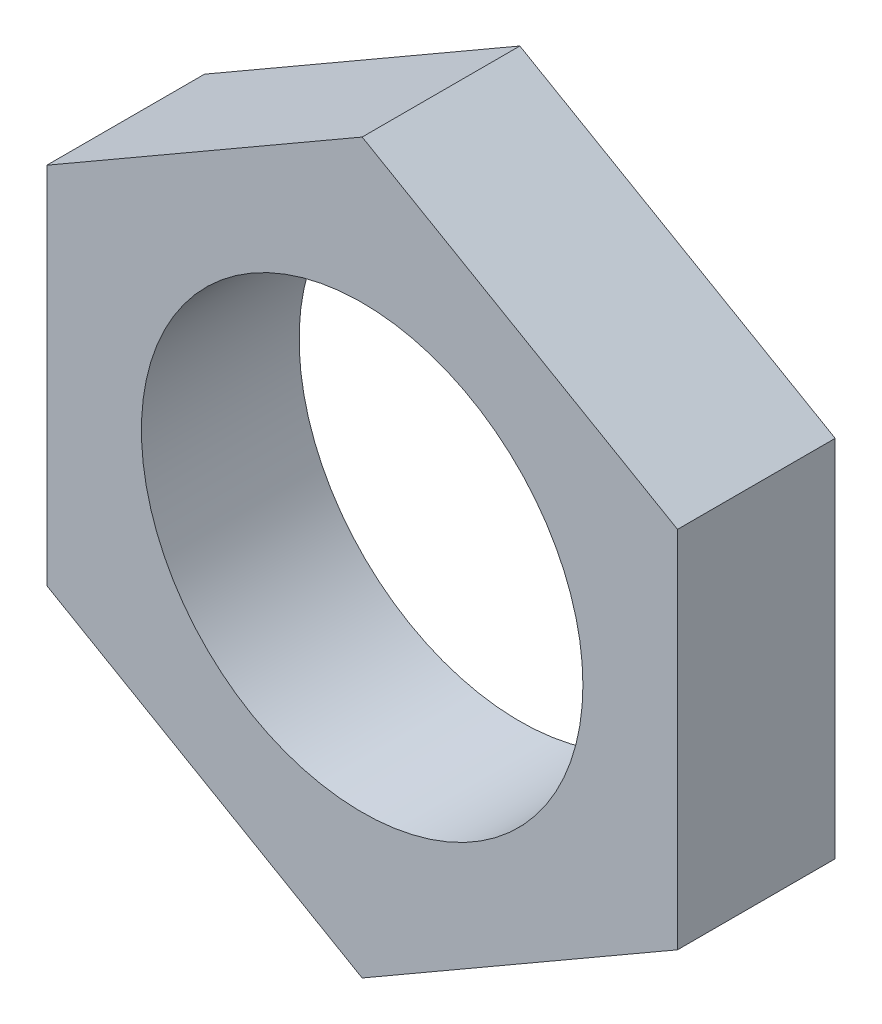
ISO-10303-21;
HEADER;
FILE_DESCRIPTION(('STEP AP214'),'2;1');
FILE_NAME('part.step','',(''),(''),'','','');
FILE_SCHEMA(('AUTOMOTIVE_DESIGN { 1 0 10303 214 1 1 1 1 }'));
ENDSEC;
DATA;
#1=APPLICATION_CONTEXT('core data for automotive mechanical design processes');
#2=APPLICATION_PROTOCOL_DEFINITION('international standard','automotive_design',2000,#1);
#3=PRODUCT_CONTEXT('',#1,'mechanical');
#4=PRODUCT('Part','Part','',(#3));
#5=PRODUCT_RELATED_PRODUCT_CATEGORY('part','',(#4));
#6=PRODUCT_DEFINITION_FORMATION('','',#4);
#7=PRODUCT_DEFINITION_CONTEXT('part definition',#1,'design');
#8=PRODUCT_DEFINITION('design','',#6,#7);
#9=PRODUCT_DEFINITION_SHAPE('','',#8);
#10=(LENGTH_UNIT() NAMED_UNIT(*) SI_UNIT(.MILLI.,.METRE.));
#11=(NAMED_UNIT(*) PLANE_ANGLE_UNIT() SI_UNIT($,.RADIAN.));
#12=(NAMED_UNIT(*) SI_UNIT($,.STERADIAN.) SOLID_ANGLE_UNIT());
#13=UNCERTAINTY_MEASURE_WITH_UNIT(LENGTH_MEASURE(1.E-05),#10,'distance_accuracy_value','');
#14=(GEOMETRIC_REPRESENTATION_CONTEXT(3) GLOBAL_UNCERTAINTY_ASSIGNED_CONTEXT((#13)) GLOBAL_UNIT_ASSIGNED_CONTEXT((#10,
#11,#12)) REPRESENTATION_CONTEXT('',''));
#15=CARTESIAN_POINT('',(0.,0.,0.));
#16=DIRECTION('',(0.,0.,1.));
#17=DIRECTION('',(1.,0.,0.));
#18=AXIS2_PLACEMENT_3D('',#15,#16,#17);
#19=CARTESIAN_POINT('',(4.,2.30940107675851,2.));
#20=DIRECTION('',(0.,0.,-1.));
#21=DIRECTION('',(-1.,0.,0.));
#22=AXIS2_PLACEMENT_3D('',#19,#20,#21);
#23=PLANE('',#22);
#24=DIRECTION('',(-0.866025403784439,0.5,0.));
#25=VECTOR('',#24,1.);
#26=CARTESIAN_POINT('',(4.,2.30940107675851,2.));
#27=LINE('',#26,#25);
#28=CARTESIAN_POINT('',(4.,2.30940107675851,2.));
#29=VERTEX_POINT('',#28);
#30=CARTESIAN_POINT('',(0.,4.61880215351701,2.));
#31=VERTEX_POINT('',#30);
#32=EDGE_CURVE('E127',#29,#31,#27,.T.);
#33=ORIENTED_EDGE('',*,*,#32,.T.);
#34=DIRECTION('',(-0.866025403784438,-0.5,0.));
#35=VECTOR('',#34,1.);
#36=CARTESIAN_POINT('',(0.,4.61880215351701,2.));
#37=LINE('',#36,#35);
#38=CARTESIAN_POINT('',(-4.,2.3094010767585,2.));
#39=VERTEX_POINT('',#38);
#40=EDGE_CURVE('E85',#31,#39,#37,.T.);
#41=ORIENTED_EDGE('',*,*,#40,.T.);
#42=DIRECTION('',(0.,-1.,0.));
#43=VECTOR('',#42,1.);
#44=CARTESIAN_POINT('',(-4.,2.3094010767585,2.));
#45=LINE('',#44,#43);
#46=CARTESIAN_POINT('',(-4.,-2.30940107675851,2.));
#47=VERTEX_POINT('',#46);
#48=EDGE_CURVE('E98',#39,#47,#45,.T.);
#49=ORIENTED_EDGE('',*,*,#48,.T.);
#50=DIRECTION('',(0.866025403784439,-0.5,0.));
#51=VECTOR('',#50,1.);
#52=CARTESIAN_POINT('',(-4.,-2.30940107675851,2.));
#53=LINE('',#52,#51);
#54=CARTESIAN_POINT('',(0.,-4.61880215351701,2.));
#55=VERTEX_POINT('',#54);
#56=EDGE_CURVE('E92',#47,#55,#53,.T.);
#57=ORIENTED_EDGE('',*,*,#56,.T.);
#58=DIRECTION('',(0.866025403784439,0.5,0.));
#59=VECTOR('',#58,1.);
#60=CARTESIAN_POINT('',(0.,-4.61880215351701,2.));
#61=LINE('',#60,#59);
#62=CARTESIAN_POINT('',(3.99999999999999,-2.30940107675851,2.));
#63=VERTEX_POINT('',#62);
#64=EDGE_CURVE('E96',#55,#63,#61,.T.);
#65=ORIENTED_EDGE('',*,*,#64,.T.);
#66=DIRECTION('',(0.,1.,0.));
#67=VECTOR('',#66,1.);
#68=CARTESIAN_POINT('',(3.99999999999999,-2.30940107675851,2.));
#69=LINE('',#68,#67);
#70=EDGE_CURVE('E48',#63,#29,#69,.T.);
#71=ORIENTED_EDGE('',*,*,#70,.T.);
#72=EDGE_LOOP('',(#33,#41,#49,#57,#65,#71));
#73=FACE_BOUND('',#72,.T.);
#74=CARTESIAN_POINT('',(0.,0.,2.));
#75=DIRECTION('',(0.,0.,1.));
#76=DIRECTION('',(1.,0.,0.));
#77=AXIS2_PLACEMENT_3D('',#74,#75,#76);
#78=CIRCLE('',#77,2.8);
#79=CARTESIAN_POINT('',(2.8,0.,2.));
#80=VERTEX_POINT('',#79);
#81=EDGE_CURVE('E120',#80,#80,#78,.T.);
#82=ORIENTED_EDGE('',*,*,#81,.F.);
#83=EDGE_LOOP('',(#82));
#84=FACE_BOUND('',#83,.T.);
#85=ADVANCED_FACE('F31',(#73,#84),#23,.F.);
#86=CARTESIAN_POINT('',(4.,2.30940107675851,0.));
#87=DIRECTION('',(0.,0.,-1.));
#88=DIRECTION('',(-1.,0.,0.));
#89=AXIS2_PLACEMENT_3D('',#86,#87,#88);
#90=PLANE('',#89);
#91=DIRECTION('',(-0.866025403784439,0.5,0.));
#92=VECTOR('',#91,1.);
#93=CARTESIAN_POINT('',(4.,2.30940107675851,0.));
#94=LINE('',#93,#92);
#95=CARTESIAN_POINT('',(4.,2.30940107675851,0.));
#96=VERTEX_POINT('',#95);
#97=CARTESIAN_POINT('',(0.,4.61880215351701,0.));
#98=VERTEX_POINT('',#97);
#99=EDGE_CURVE('E116',#96,#98,#94,.T.);
#100=ORIENTED_EDGE('',*,*,#99,.F.);
#101=DIRECTION('',(0.,1.,0.));
#102=VECTOR('',#101,1.);
#103=CARTESIAN_POINT('',(3.99999999999999,-2.30940107675851,0.));
#104=LINE('',#103,#102);
#105=CARTESIAN_POINT('',(3.99999999999999,-2.30940107675851,0.));
#106=VERTEX_POINT('',#105);
#107=EDGE_CURVE('E77',#106,#96,#104,.T.);
#108=ORIENTED_EDGE('',*,*,#107,.F.);
#109=DIRECTION('',(0.866025403784439,0.5,0.));
#110=VECTOR('',#109,1.);
#111=CARTESIAN_POINT('',(0.,-4.61880215351701,0.));
#112=LINE('',#111,#110);
#113=CARTESIAN_POINT('',(0.,-4.61880215351701,0.));
#114=VERTEX_POINT('',#113);
#115=EDGE_CURVE('E71',#114,#106,#112,.T.);
#116=ORIENTED_EDGE('',*,*,#115,.F.);
#117=DIRECTION('',(0.866025403784439,-0.5,0.));
#118=VECTOR('',#117,1.);
#119=CARTESIAN_POINT('',(-4.,-2.30940107675851,0.));
#120=LINE('',#119,#118);
#121=CARTESIAN_POINT('',(-4.,-2.30940107675851,0.));
#122=VERTEX_POINT('',#121);
#123=EDGE_CURVE('E106',#122,#114,#120,.T.);
#124=ORIENTED_EDGE('',*,*,#123,.F.);
#125=DIRECTION('',(0.,-1.,0.));
#126=VECTOR('',#125,1.);
#127=CARTESIAN_POINT('',(-4.,2.3094010767585,0.));
#128=LINE('',#127,#126);
#129=CARTESIAN_POINT('',(-4.,2.3094010767585,0.));
#130=VERTEX_POINT('',#129);
#131=EDGE_CURVE('E122',#130,#122,#128,.T.);
#132=ORIENTED_EDGE('',*,*,#131,.F.);
#133=DIRECTION('',(-0.866025403784438,-0.5,0.));
#134=VECTOR('',#133,1.);
#135=CARTESIAN_POINT('',(0.,4.61880215351701,0.));
#136=LINE('',#135,#134);
#137=EDGE_CURVE('E119',#98,#130,#136,.T.);
#138=ORIENTED_EDGE('',*,*,#137,.F.);
#139=EDGE_LOOP('',(#100,#108,#116,#124,#132,#138));
#140=FACE_BOUND('',#139,.T.);
#141=CARTESIAN_POINT('',(0.,0.,0.));
#142=DIRECTION('',(0.,0.,1.));
#143=DIRECTION('',(1.,0.,0.));
#144=AXIS2_PLACEMENT_3D('',#141,#142,#143);
#145=CIRCLE('',#144,2.8);
#146=CARTESIAN_POINT('',(2.8,0.,0.));
#147=VERTEX_POINT('',#146);
#148=EDGE_CURVE('E220',#147,#147,#145,.T.);
#149=ORIENTED_EDGE('',*,*,#148,.T.);
#150=EDGE_LOOP('',(#149));
#151=FACE_BOUND('',#150,.T.);
#152=ADVANCED_FACE('F136',(#140,#151),#90,.T.);
#153=CARTESIAN_POINT('',(4.,2.30940107675851,2.));
#154=DIRECTION('',(-0.5,-0.866025403784439,0.));
#155=DIRECTION('',(0.866025403784439,-0.5,0.));
#156=AXIS2_PLACEMENT_3D('',#153,#154,#155);
#157=PLANE('',#156);
#158=ORIENTED_EDGE('',*,*,#99,.T.);
#159=DIRECTION('',(0.,0.,-1.));
#160=VECTOR('',#159,1.);
#161=CARTESIAN_POINT('',(0.,4.61880215351701,2.));
#162=LINE('',#161,#160);
#163=EDGE_CURVE('E11',#31,#98,#162,.T.);
#164=ORIENTED_EDGE('',*,*,#163,.F.);
#165=ORIENTED_EDGE('',*,*,#32,.F.);
#166=DIRECTION('',(0.,0.,-1.));
#167=VECTOR('',#166,1.);
#168=CARTESIAN_POINT('',(4.,2.30940107675851,2.));
#169=LINE('',#168,#167);
#170=EDGE_CURVE('E112',#29,#96,#169,.T.);
#171=ORIENTED_EDGE('',*,*,#170,.T.);
#172=EDGE_LOOP('',(#158,#164,#165,#171));
#173=FACE_BOUND('',#172,.T.);
#174=ADVANCED_FACE('F33',(#173),#157,.F.);
#175=CARTESIAN_POINT('',(0.,4.61880215351701,2.));
#176=DIRECTION('',(0.5,-0.866025403784438,0.));
#177=DIRECTION('',(0.866025403784438,0.5,0.));
#178=AXIS2_PLACEMENT_3D('',#175,#176,#177);
#179=PLANE('',#178);
#180=ORIENTED_EDGE('',*,*,#137,.T.);
#181=DIRECTION('',(0.,0.,-1.));
#182=VECTOR('',#181,1.);
#183=CARTESIAN_POINT('',(-4.,2.3094010767585,2.));
#184=LINE('',#183,#182);
#185=EDGE_CURVE('E40',#39,#130,#184,.T.);
#186=ORIENTED_EDGE('',*,*,#185,.F.);
#187=ORIENTED_EDGE('',*,*,#40,.F.);
#188=ORIENTED_EDGE('',*,*,#163,.T.);
#189=EDGE_LOOP('',(#180,#186,#187,#188));
#190=FACE_BOUND('',#189,.T.);
#191=ADVANCED_FACE('F161',(#190),#179,.F.);
#192=CARTESIAN_POINT('',(-4.,2.3094010767585,2.));
#193=DIRECTION('',(1.,0.,0.));
#194=DIRECTION('',(0.,0.,-1.));
#195=AXIS2_PLACEMENT_3D('',#192,#193,#194);
#196=PLANE('',#195);
#197=ORIENTED_EDGE('',*,*,#131,.T.);
#198=DIRECTION('',(0.,0.,-1.));
#199=VECTOR('',#198,1.);
#200=CARTESIAN_POINT('',(-4.,-2.30940107675851,2.));
#201=LINE('',#200,#199);
#202=EDGE_CURVE('E107',#47,#122,#201,.T.);
#203=ORIENTED_EDGE('',*,*,#202,.F.);
#204=ORIENTED_EDGE('',*,*,#48,.F.);
#205=ORIENTED_EDGE('',*,*,#185,.T.);
#206=EDGE_LOOP('',(#197,#203,#204,#205));
#207=FACE_BOUND('',#206,.T.);
#208=ADVANCED_FACE('F133',(#207),#196,.F.);
#209=CARTESIAN_POINT('',(-4.,-2.30940107675851,2.));
#210=DIRECTION('',(0.5,0.866025403784439,0.));
#211=DIRECTION('',(-0.866025403784439,0.5,0.));
#212=AXIS2_PLACEMENT_3D('',#209,#210,#211);
#213=PLANE('',#212);
#214=ORIENTED_EDGE('',*,*,#123,.T.);
#215=DIRECTION('',(0.,0.,-1.));
#216=VECTOR('',#215,1.);
#217=CARTESIAN_POINT('',(0.,-4.61880215351701,2.));
#218=LINE('',#217,#216);
#219=EDGE_CURVE('E103',#55,#114,#218,.T.);
#220=ORIENTED_EDGE('',*,*,#219,.F.);
#221=ORIENTED_EDGE('',*,*,#56,.F.);
#222=ORIENTED_EDGE('',*,*,#202,.T.);
#223=EDGE_LOOP('',(#214,#220,#221,#222));
#224=FACE_BOUND('',#223,.T.);
#225=ADVANCED_FACE('F104',(#224),#213,.F.);
#226=CARTESIAN_POINT('',(0.,-4.61880215351701,2.));
#227=DIRECTION('',(-0.5,0.866025403784439,0.));
#228=DIRECTION('',(-0.866025403784439,-0.5,0.));
#229=AXIS2_PLACEMENT_3D('',#226,#227,#228);
#230=PLANE('',#229);
#231=ORIENTED_EDGE('',*,*,#115,.T.);
#232=DIRECTION('',(0.,0.,-1.));
#233=VECTOR('',#232,1.);
#234=CARTESIAN_POINT('',(3.99999999999999,-2.30940107675851,2.));
#235=LINE('',#234,#233);
#236=EDGE_CURVE('E108',#63,#106,#235,.T.);
#237=ORIENTED_EDGE('',*,*,#236,.F.);
#238=ORIENTED_EDGE('',*,*,#64,.F.);
#239=ORIENTED_EDGE('',*,*,#219,.T.);
#240=EDGE_LOOP('',(#231,#237,#238,#239));
#241=FACE_BOUND('',#240,.T.);
#242=ADVANCED_FACE('F110',(#241),#230,.F.);
#243=CARTESIAN_POINT('',(3.99999999999999,-2.30940107675851,2.));
#244=DIRECTION('',(-1.,0.,0.));
#245=DIRECTION('',(0.,-1.,0.));
#246=AXIS2_PLACEMENT_3D('',#243,#244,#245);
#247=PLANE('',#246);
#248=ORIENTED_EDGE('',*,*,#107,.T.);
#249=ORIENTED_EDGE('',*,*,#170,.F.);
#250=ORIENTED_EDGE('',*,*,#70,.F.);
#251=ORIENTED_EDGE('',*,*,#236,.T.);
#252=EDGE_LOOP('',(#248,#249,#250,#251));
#253=FACE_BOUND('',#252,.T.);
#254=ADVANCED_FACE('F141',(#253),#247,.F.);
#255=CARTESIAN_POINT('',(0.,0.,2.));
#256=DIRECTION('',(0.,0.,-1.));
#257=DIRECTION('',(-1.,0.,0.));
#258=AXIS2_PLACEMENT_3D('',#255,#256,#257);
#259=CYLINDRICAL_SURFACE('',#258,2.8);
#260=ORIENTED_EDGE('',*,*,#81,.T.);
#261=EDGE_LOOP('',(#260));
#262=FACE_BOUND('',#261,.T.);
#263=ORIENTED_EDGE('',*,*,#148,.F.);
#264=EDGE_LOOP('',(#263));
#265=FACE_BOUND('',#264,.T.);
#266=ADVANCED_FACE('F143',(#262,#265),#259,.F.);
#267=CLOSED_SHELL('',(#85,#152,#174,#191,#208,#225,#242,#254,#266));
#268=MANIFOLD_SOLID_BREP('B2',#267);
#269=ADVANCED_BREP_SHAPE_REPRESENTATION('',(#18,#268),#14);
#270=SHAPE_DEFINITION_REPRESENTATION(#9,#269);
ENDSEC;
END-ISO-10303-21;
